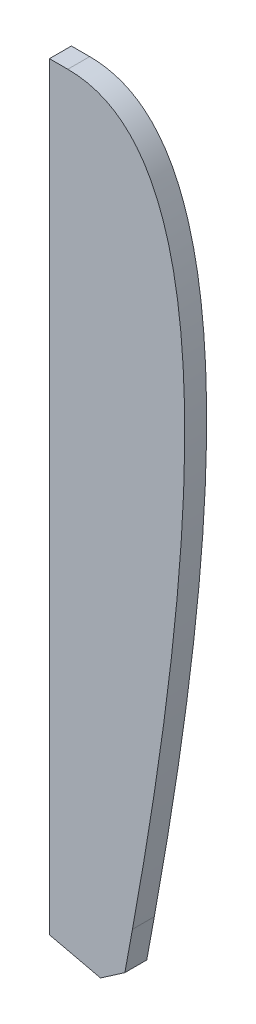
ISO-10303-21;
HEADER;
FILE_DESCRIPTION(('STEP AP214'),'2;1');
FILE_NAME('part.step','',(''),(''),'','','');
FILE_SCHEMA(('AUTOMOTIVE_DESIGN { 1 0 10303 214 1 1 1 1 }'));
ENDSEC;
DATA;
#1=APPLICATION_CONTEXT('core data for automotive mechanical design processes');
#2=APPLICATION_PROTOCOL_DEFINITION('international standard','automotive_design',2000,#1);
#3=PRODUCT_CONTEXT('',#1,'mechanical');
#4=PRODUCT('Part','Part','',(#3));
#5=PRODUCT_RELATED_PRODUCT_CATEGORY('part','',(#4));
#6=PRODUCT_DEFINITION_FORMATION('','',#4);
#7=PRODUCT_DEFINITION_CONTEXT('part definition',#1,'design');
#8=PRODUCT_DEFINITION('design','',#6,#7);
#9=PRODUCT_DEFINITION_SHAPE('','',#8);
#10=(LENGTH_UNIT() NAMED_UNIT(*) SI_UNIT(.MILLI.,.METRE.));
#11=(NAMED_UNIT(*) PLANE_ANGLE_UNIT() SI_UNIT($,.RADIAN.));
#12=(NAMED_UNIT(*) SI_UNIT($,.STERADIAN.) SOLID_ANGLE_UNIT());
#13=UNCERTAINTY_MEASURE_WITH_UNIT(LENGTH_MEASURE(1.E-05),#10,'distance_accuracy_value','');
#14=(GEOMETRIC_REPRESENTATION_CONTEXT(3) GLOBAL_UNCERTAINTY_ASSIGNED_CONTEXT((#13)) GLOBAL_UNIT_ASSIGNED_CONTEXT((#10,
#11,#12)) REPRESENTATION_CONTEXT('',''));
#15=CARTESIAN_POINT('',(0.,0.,0.));
#16=DIRECTION('',(0.,0.,1.));
#17=DIRECTION('',(1.,0.,0.));
#18=AXIS2_PLACEMENT_3D('',#15,#16,#17);
#19=CARTESIAN_POINT('',(12.7000000000001,-5464.96353161895,-12.7));
#20=DIRECTION('',(-1.,0.,0.));
#21=DIRECTION('',(0.,-1.,0.));
#22=AXIS2_PLACEMENT_3D('',#19,#20,#21);
#23=PLANE('',#22);
#24=DIRECTION('',(0.,-1.,0.));
#25=VECTOR('',#24,1.);
#26=CARTESIAN_POINT('',(12.7000000000001,-5464.96353161895,0.));
#27=LINE('',#26,#25);
#28=CARTESIAN_POINT('',(12.7000000000001,-5024.87840407148,0.));
#29=VERTEX_POINT('',#28);
#30=CARTESIAN_POINT('',(12.7000000000001,-5464.96353161895,0.));
#31=VERTEX_POINT('',#30);
#32=EDGE_CURVE('E251',#29,#31,#27,.T.);
#33=ORIENTED_EDGE('',*,*,#32,.F.);
#34=DIRECTION('',(0.,0.,1.));
#35=VECTOR('',#34,1.);
#36=CARTESIAN_POINT('',(12.7000000000001,-5024.87840407148,-12.7));
#37=LINE('',#36,#35);
#38=CARTESIAN_POINT('',(12.7000000000001,-5024.87840407148,-12.7));
#39=VERTEX_POINT('',#38);
#40=EDGE_CURVE('E100',#39,#29,#37,.T.);
#41=ORIENTED_EDGE('',*,*,#40,.F.);
#42=DIRECTION('',(0.,-1.,0.));
#43=VECTOR('',#42,1.);
#44=CARTESIAN_POINT('',(12.7000000000001,-5464.96353161895,-12.7));
#45=LINE('',#44,#43);
#46=CARTESIAN_POINT('',(12.7000000000001,-5464.96353161895,-12.7));
#47=VERTEX_POINT('',#46);
#48=EDGE_CURVE('E107',#39,#47,#45,.T.);
#49=ORIENTED_EDGE('',*,*,#48,.T.);
#50=DIRECTION('',(0.,0.,1.));
#51=VECTOR('',#50,1.);
#52=CARTESIAN_POINT('',(12.7000000000001,-5464.96353161895,-12.7));
#53=LINE('',#52,#51);
#54=EDGE_CURVE('E89',#47,#31,#53,.T.);
#55=ORIENTED_EDGE('',*,*,#54,.T.);
#56=EDGE_LOOP('',(#33,#41,#49,#55));
#57=FACE_BOUND('',#56,.T.);
#58=ADVANCED_FACE('F39',(#57),#23,.T.);
#59=CARTESIAN_POINT('',(136.525,-5024.87840407148,-12.7));
#60=DIRECTION('',(0.,1.,0.));
#61=DIRECTION('',(-1.,0.,0.));
#62=AXIS2_PLACEMENT_3D('',#59,#60,#61);
#63=PLANE('',#62);
#64=DIRECTION('',(-1.,0.,0.));
#65=VECTOR('',#64,1.);
#66=CARTESIAN_POINT('',(136.525,-5024.87840407148,0.));
#67=LINE('',#66,#65);
#68=CARTESIAN_POINT('',(23.3417092088847,-5024.87840407148,0.));
#69=VERTEX_POINT('',#68);
#70=EDGE_CURVE('E113',#69,#29,#67,.T.);
#71=ORIENTED_EDGE('',*,*,#70,.F.);
#72=CARTESIAN_POINT('',(23.3417092088846,-5024.87840407148,-13.335));
#73=CARTESIAN_POINT('',(23.3417092088846,-5024.87840407148,-8.67833333333332));
#74=CARTESIAN_POINT('',(23.3417092088846,-5024.87840407148,-4.02166666666668));
#75=CARTESIAN_POINT('',(23.3417092088846,-5024.87840407148,0.634999999999997));
#76=(BOUNDED_CURVE() B_SPLINE_CURVE(3,(#72,#73,#74,#75),.UNSPECIFIED.,.F.,
.F.) B_SPLINE_CURVE_WITH_KNOTS((4,4),(-0.000635,0.013335),
.UNSPECIFIED.) CURVE() GEOMETRIC_REPRESENTATION_ITEM() RATIONAL_B_SPLINE_CURVE((1.,1.,1.,1.)) REPRESENTATION_ITEM(''));
#77=CARTESIAN_POINT('',(23.3417092088847,-5024.87840407148,-12.7));
#78=VERTEX_POINT('',#77);
#79=EDGE_CURVE('E129',#69,#78,#76,.F.);
#80=ORIENTED_EDGE('',*,*,#79,.T.);
#81=DIRECTION('',(-1.,0.,0.));
#82=VECTOR('',#81,1.);
#83=CARTESIAN_POINT('',(136.525,-5024.87840407148,-12.7));
#84=LINE('',#83,#82);
#85=EDGE_CURVE('E101',#78,#39,#84,.T.);
#86=ORIENTED_EDGE('',*,*,#85,.T.);
#87=ORIENTED_EDGE('',*,*,#40,.T.);
#88=EDGE_LOOP('',(#71,#80,#86,#87));
#89=FACE_BOUND('',#88,.T.);
#90=ADVANCED_FACE('F167',(#89),#63,.T.);
#91=CARTESIAN_POINT('',(54.140557784839,-5474.59458532461,-12.7));
#92=DIRECTION('',(0.983631192592145,-0.180193443165269,0.));
#93=DIRECTION('',(0.180193443165269,0.983631192592145,0.));
#94=AXIS2_PLACEMENT_3D('',#91,#92,#93);
#95=PLANE('',#94);
#96=DIRECTION('',(0.180193443165269,0.983631192592145,0.));
#97=VECTOR('',#96,1.);
#98=CARTESIAN_POINT('',(54.140557784839,-5474.59458532461,0.));
#99=LINE('',#98,#97);
#100=CARTESIAN_POINT('',(56.4290145130379,-5462.10246917869,0.));
#101=VERTEX_POINT('',#100);
#102=CARTESIAN_POINT('',(60.8180576466482,-5438.14377425608,0.));
#103=VERTEX_POINT('',#102);
#104=EDGE_CURVE('E115',#101,#103,#99,.T.);
#105=ORIENTED_EDGE('',*,*,#104,.F.);
#106=DIRECTION('',(0.,0.,-1.));
#107=VECTOR('',#106,1.);
#108=CARTESIAN_POINT('',(56.4290145130379,-5462.10246917869,-12.7));
#109=LINE('',#108,#107);
#110=CARTESIAN_POINT('',(56.4290145130379,-5462.10246917869,-12.7));
#111=VERTEX_POINT('',#110);
#112=EDGE_CURVE('E46',#101,#111,#109,.T.);
#113=ORIENTED_EDGE('',*,*,#112,.T.);
#114=DIRECTION('',(0.180193443165269,0.983631192592145,0.));
#115=VECTOR('',#114,1.);
#116=CARTESIAN_POINT('',(54.140557784839,-5474.59458532461,-12.7));
#117=LINE('',#116,#115);
#118=CARTESIAN_POINT('',(60.8180576466482,-5438.14377425608,-12.7));
#119=VERTEX_POINT('',#118);
#120=EDGE_CURVE('E109',#111,#119,#117,.T.);
#121=ORIENTED_EDGE('',*,*,#120,.T.);
#122=CARTESIAN_POINT('',(60.8180576466482,-5438.14377425608,0.634999999999997));
#123=CARTESIAN_POINT('',(60.8180576466482,-5438.14377425608,-4.02166666666668));
#124=CARTESIAN_POINT('',(60.8180576466482,-5438.14377425608,-8.67833333333332));
#125=CARTESIAN_POINT('',(60.8180576466482,-5438.14377425608,-13.335));
#126=(BOUNDED_CURVE() B_SPLINE_CURVE(3,(#122,#123,#124,#125),.UNSPECIFIED.,.F.,
.F.) B_SPLINE_CURVE_WITH_KNOTS((4,4),(-0.000635,0.013335),
.UNSPECIFIED.) CURVE() GEOMETRIC_REPRESENTATION_ITEM() RATIONAL_B_SPLINE_CURVE((1.,1.,1.,1.)) REPRESENTATION_ITEM(''));
#127=EDGE_CURVE('E250',#119,#103,#126,.F.);
#128=ORIENTED_EDGE('',*,*,#127,.T.);
#129=EDGE_LOOP('',(#105,#113,#121,#128));
#130=FACE_BOUND('',#129,.T.);
#131=ADVANCED_FACE('F170',(#130),#95,.T.);
#132=CARTESIAN_POINT('',(12.7000000000001,-5464.96353161895,-12.7));
#133=DIRECTION('',(-0.226373338950906,-0.974040610761285,0.));
#134=DIRECTION('',(0.974040610761285,-0.226373338950906,0.));
#135=AXIS2_PLACEMENT_3D('',#132,#133,#134);
#136=PLANE('',#135);
#137=DIRECTION('',(0.974040610761285,-0.226373338950906,0.));
#138=VECTOR('',#137,1.);
#139=CARTESIAN_POINT('',(12.7000000000001,-5464.96353161895,-12.7));
#140=LINE('',#139,#138);
#141=CARTESIAN_POINT('',(42.3147027943784,-5471.84618012409,-12.7));
#142=VERTEX_POINT('',#141);
#143=EDGE_CURVE('E93',#47,#142,#140,.T.);
#144=ORIENTED_EDGE('',*,*,#143,.T.);
#145=DIRECTION('',(0.,0.,1.));
#146=VECTOR('',#145,1.);
#147=CARTESIAN_POINT('',(42.3147027943784,-5471.84618012409,-12.7));
#148=LINE('',#147,#146);
#149=CARTESIAN_POINT('',(42.3147027943784,-5471.84618012409,0.));
#150=VERTEX_POINT('',#149);
#151=EDGE_CURVE('E125',#142,#150,#148,.T.);
#152=ORIENTED_EDGE('',*,*,#151,.T.);
#153=DIRECTION('',(0.974040610761285,-0.226373338950906,0.));
#154=VECTOR('',#153,1.);
#155=CARTESIAN_POINT('',(12.7000000000001,-5464.96353161895,0.));
#156=LINE('',#155,#154);
#157=EDGE_CURVE('E95',#31,#150,#156,.T.);
#158=ORIENTED_EDGE('',*,*,#157,.F.);
#159=ORIENTED_EDGE('',*,*,#54,.F.);
#160=EDGE_LOOP('',(#144,#152,#158,#159));
#161=FACE_BOUND('',#160,.T.);
#162=ADVANCED_FACE('F91',(#161),#136,.T.);
#163=CARTESIAN_POINT('',(0.,0.,-12.7));
#164=DIRECTION('',(0.,0.,1.));
#165=DIRECTION('',(1.,0.,0.));
#166=AXIS2_PLACEMENT_3D('',#163,#164,#165);
#167=PLANE('',#166);
#168=ORIENTED_EDGE('',*,*,#120,.F.);
#169=DIRECTION('',(0.82294829205603,0.568116280881004,0.));
#170=VECTOR('',#169,1.);
#171=CARTESIAN_POINT('',(42.3147027943784,-5471.84618012409,-12.7));
#172=LINE('',#171,#170);
#173=EDGE_CURVE('E12',#111,#142,#172,.F.);
#174=ORIENTED_EDGE('',*,*,#173,.T.);
#175=ORIENTED_EDGE('',*,*,#143,.F.);
#176=ORIENTED_EDGE('',*,*,#48,.F.);
#177=ORIENTED_EDGE('',*,*,#85,.F.);
#178=CARTESIAN_POINT('',(60.8180576466482,-5438.14377425608,-12.7));
#179=CARTESIAN_POINT('',(136.525000000004,-5024.87840407148,-12.7));
#180=CARTESIAN_POINT('',(23.3417092088846,-5024.87840407148,-12.7));
#181=(BOUNDED_CURVE() B_SPLINE_CURVE(2,(#178,#179,#180),.UNSPECIFIED.,.F.,
.F.) B_SPLINE_CURVE_WITH_KNOTS((3,3),(0.,1.),
.UNSPECIFIED.) CURVE() GEOMETRIC_REPRESENTATION_ITEM() RATIONAL_B_SPLINE_CURVE((1.,1.,1.)) REPRESENTATION_ITEM(''));
#182=EDGE_CURVE('E126',#78,#119,#181,.F.);
#183=ORIENTED_EDGE('',*,*,#182,.T.);
#184=EDGE_LOOP('',(#168,#174,#175,#176,#177,#183));
#185=FACE_BOUND('',#184,.T.);
#186=ADVANCED_FACE('F105',(#185),#167,.F.);
#187=CARTESIAN_POINT('',(0.,0.,0.));
#188=DIRECTION('',(0.,0.,1.));
#189=DIRECTION('',(1.,0.,0.));
#190=AXIS2_PLACEMENT_3D('',#187,#188,#189);
#191=PLANE('',#190);
#192=ORIENTED_EDGE('',*,*,#157,.T.);
#193=DIRECTION('',(-0.82294829205603,-0.568116280881004,0.));
#194=VECTOR('',#193,1.);
#195=CARTESIAN_POINT('',(2571.91134103051,-3725.55780682498,0.));
#196=LINE('',#195,#194);
#197=EDGE_CURVE('E60',#150,#101,#196,.F.);
#198=ORIENTED_EDGE('',*,*,#197,.T.);
#199=ORIENTED_EDGE('',*,*,#104,.T.);
#200=CARTESIAN_POINT('',(23.3417092088846,-5024.87840407148,0.));
#201=CARTESIAN_POINT('',(136.525000000004,-5024.87840407148,0.));
#202=CARTESIAN_POINT('',(60.8180576466482,-5438.14377425608,0.));
#203=(BOUNDED_CURVE() B_SPLINE_CURVE(2,(#200,#201,#202),.UNSPECIFIED.,.F.,
.F.) B_SPLINE_CURVE_WITH_KNOTS((3,3),(0.,1.),
.UNSPECIFIED.) CURVE() GEOMETRIC_REPRESENTATION_ITEM() RATIONAL_B_SPLINE_CURVE((1.,1.,1.)) REPRESENTATION_ITEM(''));
#204=EDGE_CURVE('E148',#103,#69,#203,.F.);
#205=ORIENTED_EDGE('',*,*,#204,.T.);
#206=ORIENTED_EDGE('',*,*,#70,.T.);
#207=ORIENTED_EDGE('',*,*,#32,.T.);
#208=EDGE_LOOP('',(#192,#198,#199,#205,#206,#207));
#209=FACE_BOUND('',#208,.T.);
#210=ADVANCED_FACE('F155',(#209),#191,.T.);
#211=CARTESIAN_POINT('',(60.8180576466482,-5438.14377425608,-13.335));
#212=CARTESIAN_POINT('',(60.8180576466482,-5438.14377425608,-8.67833333333332));
#213=CARTESIAN_POINT('',(60.8180576466482,-5438.14377425608,-4.02166666666668));
#214=CARTESIAN_POINT('',(60.8180576466482,-5438.14377425608,0.634999999999997));
#215=CARTESIAN_POINT('',(136.525000000004,-5024.87840407148,-13.335));
#216=CARTESIAN_POINT('',(136.525000000004,-5024.87840407148,-8.67833333333332));
#217=CARTESIAN_POINT('',(136.525000000004,-5024.87840407148,-4.02166666666668));
#218=CARTESIAN_POINT('',(136.525000000004,-5024.87840407148,0.634999999999997));
#219=CARTESIAN_POINT('',(23.3417092088846,-5024.87840407148,-13.335));
#220=CARTESIAN_POINT('',(23.3417092088846,-5024.87840407148,-8.67833333333332));
#221=CARTESIAN_POINT('',(23.3417092088846,-5024.87840407148,-4.02166666666668));
#222=CARTESIAN_POINT('',(23.3417092088846,-5024.87840407148,0.634999999999997));
#223=(BOUNDED_SURFACE() B_SPLINE_SURFACE(2,3,((#211,#212,#213,#214),(#215,#216,#217,#218),(#219,
#220,#221,#222)),.UNSPECIFIED.,.F.,.F.,.F.) B_SPLINE_SURFACE_WITH_KNOTS((3,3),(4,4),(0.,1.),
(-0.000635,0.013335),
.UNSPECIFIED.) GEOMETRIC_REPRESENTATION_ITEM() RATIONAL_B_SPLINE_SURFACE(((1.,1.,1.,1.),(1.,1.,
1.,1.),(1.,1.,1.,1.))) REPRESENTATION_ITEM('') SURFACE());
#224=ORIENTED_EDGE('',*,*,#182,.F.);
#225=ORIENTED_EDGE('',*,*,#79,.F.);
#226=ORIENTED_EDGE('',*,*,#204,.F.);
#227=ORIENTED_EDGE('',*,*,#127,.F.);
#228=EDGE_LOOP('',(#224,#225,#226,#227));
#229=FACE_BOUND('',#228,.T.);
#230=ADVANCED_FACE('F165',(#229),#223,.T.);
#231=CARTESIAN_POINT('',(42.3147027943784,-5471.84618012409,-12.7));
#232=DIRECTION('',(-0.568116280881004,0.82294829205603,0.));
#233=DIRECTION('',(0.,0.,1.));
#234=AXIS2_PLACEMENT_3D('',#231,#232,#233);
#235=PLANE('',#234);
#236=ORIENTED_EDGE('',*,*,#173,.F.);
#237=ORIENTED_EDGE('',*,*,#112,.F.);
#238=ORIENTED_EDGE('',*,*,#197,.F.);
#239=ORIENTED_EDGE('',*,*,#151,.F.);
#240=EDGE_LOOP('',(#236,#237,#238,#239));
#241=FACE_BOUND('',#240,.T.);
#242=ADVANCED_FACE('F41',(#241),#235,.F.);
#243=CLOSED_SHELL('',(#58,#90,#131,#162,#186,#210,#230,#242));
#244=MANIFOLD_SOLID_BREP('B2',#243);
#245=ADVANCED_BREP_SHAPE_REPRESENTATION('',(#18,#244),#14);
#246=SHAPE_DEFINITION_REPRESENTATION(#9,#245);
ENDSEC;
END-ISO-10303-21;
